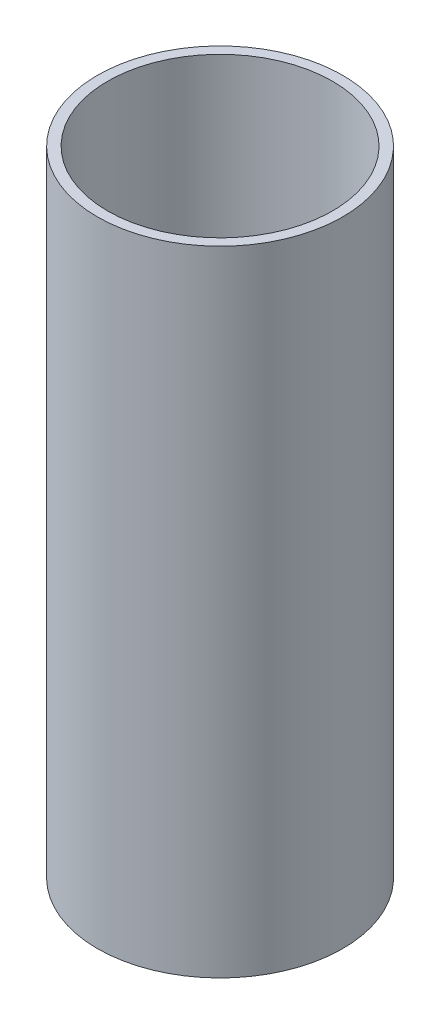
ISO-10303-21;
HEADER;
FILE_DESCRIPTION(('STEP AP214'),'2;1');
FILE_NAME('part.step','',(''),(''),'','','');
FILE_SCHEMA(('AUTOMOTIVE_DESIGN { 1 0 10303 214 1 1 1 1 }'));
ENDSEC;
DATA;
#1=APPLICATION_CONTEXT('core data for automotive mechanical design processes');
#2=APPLICATION_PROTOCOL_DEFINITION('international standard','automotive_design',2000,#1);
#3=PRODUCT_CONTEXT('',#1,'mechanical');
#4=PRODUCT('Part','Part','',(#3));
#5=PRODUCT_RELATED_PRODUCT_CATEGORY('part','',(#4));
#6=PRODUCT_DEFINITION_FORMATION('','',#4);
#7=PRODUCT_DEFINITION_CONTEXT('part definition',#1,'design');
#8=PRODUCT_DEFINITION('design','',#6,#7);
#9=PRODUCT_DEFINITION_SHAPE('','',#8);
#10=(LENGTH_UNIT() NAMED_UNIT(*) SI_UNIT(.MILLI.,.METRE.));
#11=(NAMED_UNIT(*) PLANE_ANGLE_UNIT() SI_UNIT($,.RADIAN.));
#12=(NAMED_UNIT(*) SI_UNIT($,.STERADIAN.) SOLID_ANGLE_UNIT());
#13=UNCERTAINTY_MEASURE_WITH_UNIT(LENGTH_MEASURE(1.E-05),#10,'distance_accuracy_value','');
#14=(GEOMETRIC_REPRESENTATION_CONTEXT(3) GLOBAL_UNCERTAINTY_ASSIGNED_CONTEXT((#13)) GLOBAL_UNIT_ASSIGNED_CONTEXT((#10,
#11,#12)) REPRESENTATION_CONTEXT('',''));
#15=CARTESIAN_POINT('',(0.,0.,0.));
#16=DIRECTION('',(0.,0.,1.));
#17=DIRECTION('',(1.,0.,0.));
#18=AXIS2_PLACEMENT_3D('',#15,#16,#17);
#19=CARTESIAN_POINT('',(0.701910903572758,98.425,0.));
#20=DIRECTION('',(0.,-1.,0.));
#21=DIRECTION('',(0.,0.,-1.));
#22=AXIS2_PLACEMENT_3D('',#19,#20,#21);
#23=CYLINDRICAL_SURFACE('',#22,19.05);
#24=CARTESIAN_POINT('',(0.701910903572758,98.425,0.));
#25=DIRECTION('',(0.,1.,0.));
#26=DIRECTION('',(0.,0.,1.));
#27=AXIS2_PLACEMENT_3D('',#24,#25,#26);
#28=CIRCLE('',#27,19.05);
#29=CARTESIAN_POINT('',(0.701910903572758,98.425,19.05));
#30=VERTEX_POINT('',#29);
#31=EDGE_CURVE('E10',#30,#30,#28,.T.);
#32=ORIENTED_EDGE('',*,*,#31,.F.);
#33=EDGE_LOOP('',(#32));
#34=FACE_BOUND('',#33,.T.);
#35=CARTESIAN_POINT('',(0.701910903572758,0.,0.));
#36=DIRECTION('',(0.,1.,0.));
#37=DIRECTION('',(0.,0.,1.));
#38=AXIS2_PLACEMENT_3D('',#35,#36,#37);
#39=CIRCLE('',#38,19.05);
#40=CARTESIAN_POINT('',(0.701910903572758,0.,19.05));
#41=VERTEX_POINT('',#40);
#42=EDGE_CURVE('E34',#41,#41,#39,.T.);
#43=ORIENTED_EDGE('',*,*,#42,.T.);
#44=EDGE_LOOP('',(#43));
#45=FACE_BOUND('',#44,.T.);
#46=ADVANCED_FACE('F31',(#34,#45),#23,.T.);
#47=CARTESIAN_POINT('',(0.701910903572758,98.425,0.));
#48=DIRECTION('',(0.,1.,0.));
#49=DIRECTION('',(0.,0.,1.));
#50=AXIS2_PLACEMENT_3D('',#47,#48,#49);
#51=PLANE('',#50);
#52=CARTESIAN_POINT('',(0.701910903572758,98.425,0.));
#53=DIRECTION('',(0.,1.,0.));
#54=DIRECTION('',(0.,0.,1.));
#55=AXIS2_PLACEMENT_3D('',#52,#53,#54);
#56=CIRCLE('',#55,17.4625);
#57=CARTESIAN_POINT('',(0.701910903572758,98.425,17.4625));
#58=VERTEX_POINT('',#57);
#59=EDGE_CURVE('E43',#58,#58,#56,.T.);
#60=ORIENTED_EDGE('',*,*,#59,.F.);
#61=EDGE_LOOP('',(#60));
#62=FACE_BOUND('',#61,.T.);
#63=ORIENTED_EDGE('',*,*,#31,.T.);
#64=EDGE_LOOP('',(#63));
#65=FACE_BOUND('',#64,.T.);
#66=ADVANCED_FACE('F76',(#62,#65),#51,.T.);
#67=CARTESIAN_POINT('',(0.701910903572758,0.,0.));
#68=DIRECTION('',(0.,1.,0.));
#69=DIRECTION('',(0.,0.,1.));
#70=AXIS2_PLACEMENT_3D('',#67,#68,#69);
#71=PLANE('',#70);
#72=ORIENTED_EDGE('',*,*,#42,.F.);
#73=EDGE_LOOP('',(#72));
#74=FACE_BOUND('',#73,.T.);
#75=ADVANCED_FACE('F72',(#74),#71,.F.);
#76=CARTESIAN_POINT('',(0.701910903572758,28.575,0.));
#77=DIRECTION('',(0.,1.,0.));
#78=DIRECTION('',(0.,0.,1.));
#79=AXIS2_PLACEMENT_3D('',#76,#77,#78);
#80=CYLINDRICAL_SURFACE('',#79,17.4625);
#81=CARTESIAN_POINT('',(0.701910903572758,28.575,0.));
#82=DIRECTION('',(0.,1.,0.));
#83=DIRECTION('',(0.,0.,1.));
#84=AXIS2_PLACEMENT_3D('',#81,#82,#83);
#85=CIRCLE('',#84,17.4625);
#86=CARTESIAN_POINT('',(0.701910903572758,28.575,17.4625));
#87=VERTEX_POINT('',#86);
#88=EDGE_CURVE('E41',#87,#87,#85,.T.);
#89=ORIENTED_EDGE('',*,*,#88,.F.);
#90=EDGE_LOOP('',(#89));
#91=FACE_BOUND('',#90,.T.);
#92=ORIENTED_EDGE('',*,*,#59,.T.);
#93=EDGE_LOOP('',(#92));
#94=FACE_BOUND('',#93,.T.);
#95=ADVANCED_FACE('F66',(#91,#94),#80,.F.);
#96=CARTESIAN_POINT('',(0.701910903572758,28.575,0.));
#97=DIRECTION('',(0.,1.,0.));
#98=DIRECTION('',(0.,0.,1.));
#99=AXIS2_PLACEMENT_3D('',#96,#97,#98);
#100=PLANE('',#99);
#101=CARTESIAN_POINT('',(0.701910903572758,28.575,0.));
#102=DIRECTION('',(0.,1.,0.));
#103=DIRECTION('',(0.,0.,1.));
#104=AXIS2_PLACEMENT_3D('',#101,#102,#103);
#105=CIRCLE('',#104,11.1125);
#106=CARTESIAN_POINT('',(0.701910903572758,28.575,11.1125));
#107=VERTEX_POINT('',#106);
#108=EDGE_CURVE('E49',#107,#107,#105,.T.);
#109=ORIENTED_EDGE('',*,*,#108,.F.);
#110=EDGE_LOOP('',(#109));
#111=FACE_BOUND('',#110,.T.);
#112=ORIENTED_EDGE('',*,*,#88,.T.);
#113=EDGE_LOOP('',(#112));
#114=FACE_BOUND('',#113,.T.);
#115=ADVANCED_FACE('F60',(#111,#114),#100,.T.);
#116=CARTESIAN_POINT('',(0.701910903572758,3.175,0.));
#117=DIRECTION('',(0.,1.,0.));
#118=DIRECTION('',(0.,0.,1.));
#119=AXIS2_PLACEMENT_3D('',#116,#117,#118);
#120=CYLINDRICAL_SURFACE('',#119,11.1125);
#121=CARTESIAN_POINT('',(0.701910903572758,3.175,0.));
#122=DIRECTION('',(0.,1.,0.));
#123=DIRECTION('',(0.,0.,1.));
#124=AXIS2_PLACEMENT_3D('',#121,#122,#123);
#125=CIRCLE('',#124,11.1125);
#126=CARTESIAN_POINT('',(0.701910903572758,3.175,11.1125));
#127=VERTEX_POINT('',#126);
#128=EDGE_CURVE('E46',#127,#127,#125,.T.);
#129=ORIENTED_EDGE('',*,*,#128,.F.);
#130=EDGE_LOOP('',(#129));
#131=FACE_BOUND('',#130,.T.);
#132=ORIENTED_EDGE('',*,*,#108,.T.);
#133=EDGE_LOOP('',(#132));
#134=FACE_BOUND('',#133,.T.);
#135=ADVANCED_FACE('F57',(#131,#134),#120,.F.);
#136=CARTESIAN_POINT('',(0.701910903572758,3.175,0.));
#137=DIRECTION('',(0.,1.,0.));
#138=DIRECTION('',(0.,0.,1.));
#139=AXIS2_PLACEMENT_3D('',#136,#137,#138);
#140=PLANE('',#139);
#141=ORIENTED_EDGE('',*,*,#128,.T.);
#142=EDGE_LOOP('',(#141));
#143=FACE_BOUND('',#142,.T.);
#144=ADVANCED_FACE('F55',(#143),#140,.T.);
#145=CLOSED_SHELL('',(#46,#66,#75,#95,#115,#135,#144));
#146=MANIFOLD_SOLID_BREP('B2',#145);
#147=ADVANCED_BREP_SHAPE_REPRESENTATION('',(#18,#146),#14);
#148=SHAPE_DEFINITION_REPRESENTATION(#9,#147);
ENDSEC;
END-ISO-10303-21;
